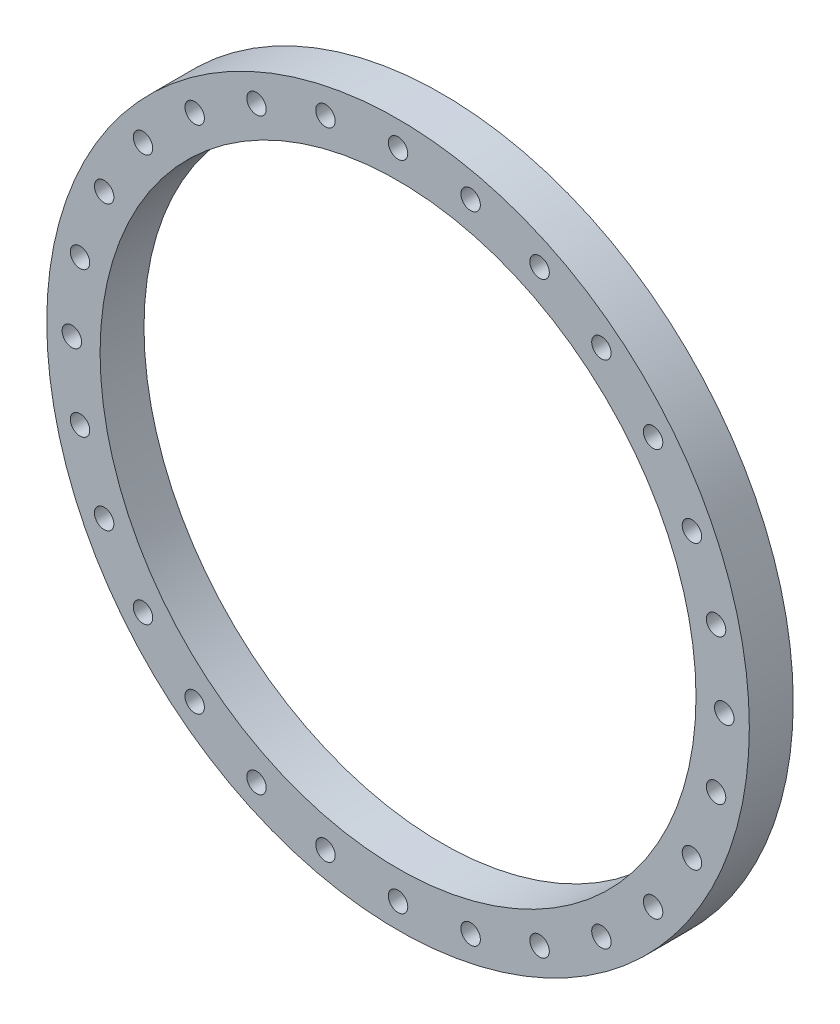
ISO-10303-21;
HEADER;
FILE_DESCRIPTION(('STEP AP214'),'2;1');
FILE_NAME('part.step','',(''),(''),'','','');
FILE_SCHEMA(('AUTOMOTIVE_DESIGN { 1 0 10303 214 1 1 1 1 }'));
ENDSEC;
DATA;
#1=APPLICATION_CONTEXT('core data for automotive mechanical design processes');
#2=APPLICATION_PROTOCOL_DEFINITION('international standard','automotive_design',2000,#1);
#3=PRODUCT_CONTEXT('',#1,'mechanical');
#4=PRODUCT('Part','Part','',(#3));
#5=PRODUCT_RELATED_PRODUCT_CATEGORY('part','',(#4));
#6=PRODUCT_DEFINITION_FORMATION('','',#4);
#7=PRODUCT_DEFINITION_CONTEXT('part definition',#1,'design');
#8=PRODUCT_DEFINITION('design','',#6,#7);
#9=PRODUCT_DEFINITION_SHAPE('','',#8);
#10=(LENGTH_UNIT() NAMED_UNIT(*) SI_UNIT(.MILLI.,.METRE.));
#11=(NAMED_UNIT(*) PLANE_ANGLE_UNIT() SI_UNIT($,.RADIAN.));
#12=(NAMED_UNIT(*) SI_UNIT($,.STERADIAN.) SOLID_ANGLE_UNIT());
#13=UNCERTAINTY_MEASURE_WITH_UNIT(LENGTH_MEASURE(1.E-05),#10,'distance_accuracy_value','');
#14=(GEOMETRIC_REPRESENTATION_CONTEXT(3) GLOBAL_UNCERTAINTY_ASSIGNED_CONTEXT((#13)) GLOBAL_UNIT_ASSIGNED_CONTEXT((#10,
#11,#12)) REPRESENTATION_CONTEXT('',''));
#15=CARTESIAN_POINT('',(0.,0.,0.));
#16=DIRECTION('',(0.,0.,1.));
#17=DIRECTION('',(1.,0.,0.));
#18=AXIS2_PLACEMENT_3D('',#15,#16,#17);
#19=CARTESIAN_POINT('',(0.,0.,7.));
#20=DIRECTION('',(0.,0.,1.));
#21=DIRECTION('',(1.,0.,0.));
#22=AXIS2_PLACEMENT_3D('',#19,#20,#21);
#23=PLANE('',#22);
#24=CARTESIAN_POINT('',(-22.561954434113,46.8503811309258,7.));
#25=DIRECTION('',(0.,0.,1.));
#26=DIRECTION('',(1.,0.,0.));
#27=AXIS2_PLACEMENT_3D('',#24,#25,#26);
#28=CIRCLE('',#27,1.55);
#29=CARTESIAN_POINT('',(-21.011954434113,46.8503811309258,7.));
#30=VERTEX_POINT('',#29);
#31=EDGE_CURVE('E206',#30,#30,#28,.T.);
#32=ORIENTED_EDGE('',*,*,#31,.F.);
#33=EDGE_LOOP('',(#32));
#34=FACE_BOUND('',#33,.T.);
#35=CARTESIAN_POINT('',(-40.6552370883376,32.4214696966541,7.));
#36=DIRECTION('',(0.,0.,1.));
#37=DIRECTION('',(1.,0.,0.));
#38=AXIS2_PLACEMENT_3D('',#35,#36,#37);
#39=CIRCLE('',#38,1.55);
#40=CARTESIAN_POINT('',(-39.1052370883376,32.4214696966541,7.));
#41=VERTEX_POINT('',#40);
#42=EDGE_CURVE('E194',#41,#41,#39,.T.);
#43=ORIENTED_EDGE('',*,*,#42,.F.);
#44=EDGE_LOOP('',(#43));
#45=FACE_BOUND('',#44,.T.);
#46=CARTESIAN_POINT('',(-50.6962514334548,11.5710885657283,7.));
#47=DIRECTION('',(0.,0.,1.));
#48=DIRECTION('',(1.,0.,0.));
#49=AXIS2_PLACEMENT_3D('',#46,#47,#48);
#50=CIRCLE('',#49,1.55);
#51=CARTESIAN_POINT('',(-49.1462514334548,11.5710885657283,7.));
#52=VERTEX_POINT('',#51);
#53=EDGE_CURVE('E182',#52,#52,#50,.T.);
#54=ORIENTED_EDGE('',*,*,#53,.F.);
#55=EDGE_LOOP('',(#54));
#56=FACE_BOUND('',#55,.T.);
#57=CARTESIAN_POINT('',(-50.6962514334548,-11.5710885657284,7.));
#58=DIRECTION('',(0.,0.,1.));
#59=DIRECTION('',(1.,0.,0.));
#60=AXIS2_PLACEMENT_3D('',#57,#58,#59);
#61=CIRCLE('',#60,1.55);
#62=CARTESIAN_POINT('',(-49.1462514334548,-11.5710885657284,7.));
#63=VERTEX_POINT('',#62);
#64=EDGE_CURVE('E170',#63,#63,#61,.T.);
#65=ORIENTED_EDGE('',*,*,#64,.F.);
#66=EDGE_LOOP('',(#65));
#67=FACE_BOUND('',#66,.T.);
#68=CARTESIAN_POINT('',(-40.6552370883375,-32.4214696966541,7.));
#69=DIRECTION('',(0.,0.,1.));
#70=DIRECTION('',(1.,0.,0.));
#71=AXIS2_PLACEMENT_3D('',#68,#69,#70);
#72=CIRCLE('',#71,1.54999999999999);
#73=CARTESIAN_POINT('',(-39.1052370883375,-32.4214696966541,7.));
#74=VERTEX_POINT('',#73);
#75=EDGE_CURVE('E158',#74,#74,#72,.T.);
#76=ORIENTED_EDGE('',*,*,#75,.F.);
#77=EDGE_LOOP('',(#76));
#78=FACE_BOUND('',#77,.T.);
#79=CARTESIAN_POINT('',(-22.561954434113,-46.8503811309258,7.));
#80=DIRECTION('',(0.,0.,1.));
#81=DIRECTION('',(1.,0.,0.));
#82=AXIS2_PLACEMENT_3D('',#79,#80,#81);
#83=CIRCLE('',#82,1.55);
#84=CARTESIAN_POINT('',(-21.011954434113,-46.8503811309258,7.));
#85=VERTEX_POINT('',#84);
#86=EDGE_CURVE('E146',#85,#85,#83,.T.);
#87=ORIENTED_EDGE('',*,*,#86,.F.);
#88=EDGE_LOOP('',(#87));
#89=FACE_BOUND('',#88,.T.);
#90=CARTESIAN_POINT('',(0.,-52.,7.));
#91=DIRECTION('',(0.,0.,1.));
#92=DIRECTION('',(1.,0.,0.));
#93=AXIS2_PLACEMENT_3D('',#90,#91,#92);
#94=CIRCLE('',#93,1.55);
#95=CARTESIAN_POINT('',(1.55000000000001,-52.,7.));
#96=VERTEX_POINT('',#95);
#97=EDGE_CURVE('E134',#96,#96,#94,.T.);
#98=ORIENTED_EDGE('',*,*,#97,.F.);
#99=EDGE_LOOP('',(#98));
#100=FACE_BOUND('',#99,.T.);
#101=CARTESIAN_POINT('',(22.561954434113,-46.8503811309258,7.));
#102=DIRECTION('',(0.,0.,1.));
#103=DIRECTION('',(1.,0.,0.));
#104=AXIS2_PLACEMENT_3D('',#101,#102,#103);
#105=CIRCLE('',#104,1.54999999999999);
#106=CARTESIAN_POINT('',(24.111954434113,-46.8503811309258,7.));
#107=VERTEX_POINT('',#106);
#108=EDGE_CURVE('E122',#107,#107,#105,.T.);
#109=ORIENTED_EDGE('',*,*,#108,.F.);
#110=EDGE_LOOP('',(#109));
#111=FACE_BOUND('',#110,.T.);
#112=CARTESIAN_POINT('',(40.6552370883376,-32.4214696966541,7.));
#113=DIRECTION('',(0.,0.,1.));
#114=DIRECTION('',(1.,0.,0.));
#115=AXIS2_PLACEMENT_3D('',#112,#113,#114);
#116=CIRCLE('',#115,1.55);
#117=CARTESIAN_POINT('',(42.2052370883376,-32.4214696966541,7.));
#118=VERTEX_POINT('',#117);
#119=EDGE_CURVE('E110',#118,#118,#116,.T.);
#120=ORIENTED_EDGE('',*,*,#119,.F.);
#121=EDGE_LOOP('',(#120));
#122=FACE_BOUND('',#121,.T.);
#123=CARTESIAN_POINT('',(50.6962514334548,-11.5710885657283,7.));
#124=DIRECTION('',(0.,0.,1.));
#125=DIRECTION('',(1.,0.,0.));
#126=AXIS2_PLACEMENT_3D('',#123,#124,#125);
#127=CIRCLE('',#126,1.54999999999999);
#128=CARTESIAN_POINT('',(52.2462514334548,-11.5710885657283,7.));
#129=VERTEX_POINT('',#128);
#130=EDGE_CURVE('E98',#129,#129,#127,.T.);
#131=ORIENTED_EDGE('',*,*,#130,.F.);
#132=EDGE_LOOP('',(#131));
#133=FACE_BOUND('',#132,.T.);
#134=CARTESIAN_POINT('',(50.6962514334548,11.5710885657283,7.));
#135=DIRECTION('',(0.,0.,1.));
#136=DIRECTION('',(1.,0.,0.));
#137=AXIS2_PLACEMENT_3D('',#134,#135,#136);
#138=CIRCLE('',#137,1.55);
#139=CARTESIAN_POINT('',(52.2462514334548,11.5710885657283,7.));
#140=VERTEX_POINT('',#139);
#141=EDGE_CURVE('E86',#140,#140,#138,.T.);
#142=ORIENTED_EDGE('',*,*,#141,.F.);
#143=EDGE_LOOP('',(#142));
#144=FACE_BOUND('',#143,.T.);
#145=CARTESIAN_POINT('',(40.6552370883376,32.4214696966541,7.));
#146=DIRECTION('',(0.,0.,1.));
#147=DIRECTION('',(1.,0.,0.));
#148=AXIS2_PLACEMENT_3D('',#145,#146,#147);
#149=CIRCLE('',#148,1.54999999999999);
#150=CARTESIAN_POINT('',(42.2052370883375,32.4214696966541,7.));
#151=VERTEX_POINT('',#150);
#152=EDGE_CURVE('E74',#151,#151,#149,.T.);
#153=ORIENTED_EDGE('',*,*,#152,.F.);
#154=EDGE_LOOP('',(#153));
#155=FACE_BOUND('',#154,.T.);
#156=CARTESIAN_POINT('',(22.561954434113,46.8503811309258,7.));
#157=DIRECTION('',(0.,0.,1.));
#158=DIRECTION('',(1.,0.,0.));
#159=AXIS2_PLACEMENT_3D('',#156,#157,#158);
#160=CIRCLE('',#159,1.55);
#161=CARTESIAN_POINT('',(24.111954434113,46.8503811309258,7.));
#162=VERTEX_POINT('',#161);
#163=EDGE_CURVE('E62',#162,#162,#160,.T.);
#164=ORIENTED_EDGE('',*,*,#163,.F.);
#165=EDGE_LOOP('',(#164));
#166=FACE_BOUND('',#165,.T.);
#167=CARTESIAN_POINT('',(0.,52.,7.));
#168=DIRECTION('',(0.,0.,1.));
#169=DIRECTION('',(1.,0.,0.));
#170=AXIS2_PLACEMENT_3D('',#167,#168,#169);
#171=CIRCLE('',#170,1.55);
#172=CARTESIAN_POINT('',(1.55,52.,7.));
#173=VERTEX_POINT('',#172);
#174=EDGE_CURVE('E50',#173,#173,#171,.T.);
#175=ORIENTED_EDGE('',*,*,#174,.F.);
#176=EDGE_LOOP('',(#175));
#177=FACE_BOUND('',#176,.T.);
#178=CARTESIAN_POINT('',(0.,0.,7.));
#179=DIRECTION('',(0.,0.,1.));
#180=DIRECTION('',(1.,0.,0.));
#181=AXIS2_PLACEMENT_3D('',#178,#179,#180);
#182=CIRCLE('',#181,56.);
#183=CARTESIAN_POINT('',(56.,0.,7.));
#184=VERTEX_POINT('',#183);
#185=EDGE_CURVE('E10',#184,#184,#182,.T.);
#186=ORIENTED_EDGE('',*,*,#185,.T.);
#187=EDGE_LOOP('',(#186));
#188=FACE_BOUND('',#187,.T.);
#189=CARTESIAN_POINT('',(0.,0.,7.));
#190=DIRECTION('',(0.,0.,1.));
#191=DIRECTION('',(1.,0.,0.));
#192=AXIS2_PLACEMENT_3D('',#189,#190,#191);
#193=CIRCLE('',#192,47.5);
#194=CARTESIAN_POINT('',(47.5,0.,7.));
#195=VERTEX_POINT('',#194);
#196=EDGE_CURVE('E45',#195,#195,#193,.T.);
#197=ORIENTED_EDGE('',*,*,#196,.F.);
#198=EDGE_LOOP('',(#197));
#199=FACE_BOUND('',#198,.T.);
#200=CARTESIAN_POINT('',(11.5710885657283,50.6962514334548,7.));
#201=DIRECTION('',(0.,0.,1.));
#202=DIRECTION('',(1.,0.,0.));
#203=AXIS2_PLACEMENT_3D('',#200,#201,#202);
#204=CIRCLE('',#203,1.55);
#205=CARTESIAN_POINT('',(13.1210885657283,50.6962514334548,7.));
#206=VERTEX_POINT('',#205);
#207=EDGE_CURVE('E56',#206,#206,#204,.T.);
#208=ORIENTED_EDGE('',*,*,#207,.F.);
#209=EDGE_LOOP('',(#208));
#210=FACE_BOUND('',#209,.T.);
#211=CARTESIAN_POINT('',(32.4214696966541,40.6552370883376,7.));
#212=DIRECTION('',(0.,0.,1.));
#213=DIRECTION('',(1.,0.,0.));
#214=AXIS2_PLACEMENT_3D('',#211,#212,#213);
#215=CIRCLE('',#214,1.54999999999999);
#216=CARTESIAN_POINT('',(33.9714696966541,40.6552370883376,7.));
#217=VERTEX_POINT('',#216);
#218=EDGE_CURVE('E68',#217,#217,#215,.T.);
#219=ORIENTED_EDGE('',*,*,#218,.F.);
#220=EDGE_LOOP('',(#219));
#221=FACE_BOUND('',#220,.T.);
#222=CARTESIAN_POINT('',(46.8503811309258,22.561954434113,7.));
#223=DIRECTION('',(0.,0.,1.));
#224=DIRECTION('',(1.,0.,0.));
#225=AXIS2_PLACEMENT_3D('',#222,#223,#224);
#226=CIRCLE('',#225,1.55);
#227=CARTESIAN_POINT('',(48.4003811309258,22.561954434113,7.));
#228=VERTEX_POINT('',#227);
#229=EDGE_CURVE('E80',#228,#228,#226,.T.);
#230=ORIENTED_EDGE('',*,*,#229,.F.);
#231=EDGE_LOOP('',(#230));
#232=FACE_BOUND('',#231,.T.);
#233=CARTESIAN_POINT('',(52.,0.,7.));
#234=DIRECTION('',(0.,0.,1.));
#235=DIRECTION('',(1.,0.,0.));
#236=AXIS2_PLACEMENT_3D('',#233,#234,#235);
#237=CIRCLE('',#236,1.54999999999999);
#238=CARTESIAN_POINT('',(53.55,0.,7.));
#239=VERTEX_POINT('',#238);
#240=EDGE_CURVE('E92',#239,#239,#237,.T.);
#241=ORIENTED_EDGE('',*,*,#240,.F.);
#242=EDGE_LOOP('',(#241));
#243=FACE_BOUND('',#242,.T.);
#244=CARTESIAN_POINT('',(46.8503811309258,-22.561954434113,7.));
#245=DIRECTION('',(0.,0.,1.));
#246=DIRECTION('',(1.,0.,0.));
#247=AXIS2_PLACEMENT_3D('',#244,#245,#246);
#248=CIRCLE('',#247,1.54999999999999);
#249=CARTESIAN_POINT('',(48.4003811309258,-22.561954434113,7.));
#250=VERTEX_POINT('',#249);
#251=EDGE_CURVE('E104',#250,#250,#248,.T.);
#252=ORIENTED_EDGE('',*,*,#251,.F.);
#253=EDGE_LOOP('',(#252));
#254=FACE_BOUND('',#253,.T.);
#255=CARTESIAN_POINT('',(32.4214696966541,-40.6552370883375,7.));
#256=DIRECTION('',(0.,0.,1.));
#257=DIRECTION('',(1.,0.,0.));
#258=AXIS2_PLACEMENT_3D('',#255,#256,#257);
#259=CIRCLE('',#258,1.54999999999999);
#260=CARTESIAN_POINT('',(33.9714696966541,-40.6552370883375,7.));
#261=VERTEX_POINT('',#260);
#262=EDGE_CURVE('E116',#261,#261,#259,.T.);
#263=ORIENTED_EDGE('',*,*,#262,.F.);
#264=EDGE_LOOP('',(#263));
#265=FACE_BOUND('',#264,.T.);
#266=CARTESIAN_POINT('',(11.5710885657284,-50.6962514334548,7.));
#267=DIRECTION('',(0.,0.,1.));
#268=DIRECTION('',(1.,0.,0.));
#269=AXIS2_PLACEMENT_3D('',#266,#267,#268);
#270=CIRCLE('',#269,1.55);
#271=CARTESIAN_POINT('',(13.1210885657284,-50.6962514334548,7.));
#272=VERTEX_POINT('',#271);
#273=EDGE_CURVE('E128',#272,#272,#270,.T.);
#274=ORIENTED_EDGE('',*,*,#273,.F.);
#275=EDGE_LOOP('',(#274));
#276=FACE_BOUND('',#275,.T.);
#277=CARTESIAN_POINT('',(-11.5710885657283,-50.6962514334548,7.));
#278=DIRECTION('',(0.,0.,1.));
#279=DIRECTION('',(1.,0.,0.));
#280=AXIS2_PLACEMENT_3D('',#277,#278,#279);
#281=CIRCLE('',#280,1.55);
#282=CARTESIAN_POINT('',(-10.0210885657283,-50.6962514334548,7.));
#283=VERTEX_POINT('',#282);
#284=EDGE_CURVE('E140',#283,#283,#281,.T.);
#285=ORIENTED_EDGE('',*,*,#284,.F.);
#286=EDGE_LOOP('',(#285));
#287=FACE_BOUND('',#286,.T.);
#288=CARTESIAN_POINT('',(-32.4214696966541,-40.6552370883376,7.));
#289=DIRECTION('',(0.,0.,1.));
#290=DIRECTION('',(1.,0.,0.));
#291=AXIS2_PLACEMENT_3D('',#288,#289,#290);
#292=CIRCLE('',#291,1.55);
#293=CARTESIAN_POINT('',(-30.8714696966541,-40.6552370883376,7.));
#294=VERTEX_POINT('',#293);
#295=EDGE_CURVE('E152',#294,#294,#292,.T.);
#296=ORIENTED_EDGE('',*,*,#295,.F.);
#297=EDGE_LOOP('',(#296));
#298=FACE_BOUND('',#297,.T.);
#299=CARTESIAN_POINT('',(-46.8503811309258,-22.561954434113,7.));
#300=DIRECTION('',(0.,0.,1.));
#301=DIRECTION('',(1.,0.,0.));
#302=AXIS2_PLACEMENT_3D('',#299,#300,#301);
#303=CIRCLE('',#302,1.55);
#304=CARTESIAN_POINT('',(-45.3003811309258,-22.561954434113,7.));
#305=VERTEX_POINT('',#304);
#306=EDGE_CURVE('E164',#305,#305,#303,.T.);
#307=ORIENTED_EDGE('',*,*,#306,.F.);
#308=EDGE_LOOP('',(#307));
#309=FACE_BOUND('',#308,.T.);
#310=CARTESIAN_POINT('',(-52.,0.,7.));
#311=DIRECTION('',(0.,0.,1.));
#312=DIRECTION('',(1.,0.,0.));
#313=AXIS2_PLACEMENT_3D('',#310,#311,#312);
#314=CIRCLE('',#313,1.55);
#315=CARTESIAN_POINT('',(-50.45,0.,7.));
#316=VERTEX_POINT('',#315);
#317=EDGE_CURVE('E176',#316,#316,#314,.T.);
#318=ORIENTED_EDGE('',*,*,#317,.F.);
#319=EDGE_LOOP('',(#318));
#320=FACE_BOUND('',#319,.T.);
#321=CARTESIAN_POINT('',(-46.8503811309258,22.561954434113,7.));
#322=DIRECTION('',(0.,0.,1.));
#323=DIRECTION('',(1.,0.,0.));
#324=AXIS2_PLACEMENT_3D('',#321,#322,#323);
#325=CIRCLE('',#324,1.55);
#326=CARTESIAN_POINT('',(-45.3003811309258,22.561954434113,7.));
#327=VERTEX_POINT('',#326);
#328=EDGE_CURVE('E188',#327,#327,#325,.T.);
#329=ORIENTED_EDGE('',*,*,#328,.F.);
#330=EDGE_LOOP('',(#329));
#331=FACE_BOUND('',#330,.T.);
#332=CARTESIAN_POINT('',(-32.4214696966541,40.6552370883375,7.));
#333=DIRECTION('',(0.,0.,1.));
#334=DIRECTION('',(1.,0.,0.));
#335=AXIS2_PLACEMENT_3D('',#332,#333,#334);
#336=CIRCLE('',#335,1.55);
#337=CARTESIAN_POINT('',(-30.8714696966541,40.6552370883375,7.));
#338=VERTEX_POINT('',#337);
#339=EDGE_CURVE('E200',#338,#338,#336,.T.);
#340=ORIENTED_EDGE('',*,*,#339,.F.);
#341=EDGE_LOOP('',(#340));
#342=FACE_BOUND('',#341,.T.);
#343=CARTESIAN_POINT('',(-11.5710885657284,50.6962514334548,7.));
#344=DIRECTION('',(0.,0.,1.));
#345=DIRECTION('',(1.,0.,0.));
#346=AXIS2_PLACEMENT_3D('',#343,#344,#345);
#347=CIRCLE('',#346,1.55);
#348=CARTESIAN_POINT('',(-10.0210885657284,50.6962514334548,7.));
#349=VERTEX_POINT('',#348);
#350=EDGE_CURVE('E212',#349,#349,#347,.T.);
#351=ORIENTED_EDGE('',*,*,#350,.F.);
#352=EDGE_LOOP('',(#351));
#353=FACE_BOUND('',#352,.T.);
#354=ADVANCED_FACE('F34',(#34,#45,#56,#67,#78,#89,#100,#111,#122,#133,#144,#155,#166,#177,#188,
#199,#210,#221,#232,#243,#254,#265,#276,#287,#298,#309,#320,#331,#342,#353),#23,.T.);
#355=CARTESIAN_POINT('',(0.,0.,0.));
#356=DIRECTION('',(0.,0.,1.));
#357=DIRECTION('',(1.,0.,0.));
#358=AXIS2_PLACEMENT_3D('',#355,#356,#357);
#359=PLANE('',#358);
#360=CARTESIAN_POINT('',(0.,0.,0.));
#361=DIRECTION('',(0.,0.,1.));
#362=DIRECTION('',(1.,0.,0.));
#363=AXIS2_PLACEMENT_3D('',#360,#361,#362);
#364=CIRCLE('',#363,56.);
#365=CARTESIAN_POINT('',(56.,0.,0.));
#366=VERTEX_POINT('',#365);
#367=EDGE_CURVE('E38',#366,#366,#364,.T.);
#368=ORIENTED_EDGE('',*,*,#367,.F.);
#369=EDGE_LOOP('',(#368));
#370=FACE_BOUND('',#369,.T.);
#371=CARTESIAN_POINT('',(0.,0.,0.));
#372=DIRECTION('',(0.,0.,1.));
#373=DIRECTION('',(1.,0.,0.));
#374=AXIS2_PLACEMENT_3D('',#371,#372,#373);
#375=CIRCLE('',#374,47.5);
#376=CARTESIAN_POINT('',(47.5,0.,0.));
#377=VERTEX_POINT('',#376);
#378=EDGE_CURVE('E47',#377,#377,#375,.T.);
#379=ORIENTED_EDGE('',*,*,#378,.T.);
#380=EDGE_LOOP('',(#379));
#381=FACE_BOUND('',#380,.T.);
#382=CARTESIAN_POINT('',(0.,52.,0.));
#383=DIRECTION('',(0.,0.,1.));
#384=DIRECTION('',(1.,0.,0.));
#385=AXIS2_PLACEMENT_3D('',#382,#383,#384);
#386=CIRCLE('',#385,1.55);
#387=CARTESIAN_POINT('',(1.55,52.,0.));
#388=VERTEX_POINT('',#387);
#389=EDGE_CURVE('E53',#388,#388,#386,.T.);
#390=ORIENTED_EDGE('',*,*,#389,.T.);
#391=EDGE_LOOP('',(#390));
#392=FACE_BOUND('',#391,.T.);
#393=CARTESIAN_POINT('',(11.5710885657283,50.6962514334548,0.));
#394=DIRECTION('',(0.,0.,1.));
#395=DIRECTION('',(1.,0.,0.));
#396=AXIS2_PLACEMENT_3D('',#393,#394,#395);
#397=CIRCLE('',#396,1.55);
#398=CARTESIAN_POINT('',(13.1210885657283,50.6962514334548,0.));
#399=VERTEX_POINT('',#398);
#400=EDGE_CURVE('E59',#399,#399,#397,.T.);
#401=ORIENTED_EDGE('',*,*,#400,.T.);
#402=EDGE_LOOP('',(#401));
#403=FACE_BOUND('',#402,.T.);
#404=CARTESIAN_POINT('',(22.561954434113,46.8503811309258,0.));
#405=DIRECTION('',(0.,0.,1.));
#406=DIRECTION('',(1.,0.,0.));
#407=AXIS2_PLACEMENT_3D('',#404,#405,#406);
#408=CIRCLE('',#407,1.55);
#409=CARTESIAN_POINT('',(24.111954434113,46.8503811309258,0.));
#410=VERTEX_POINT('',#409);
#411=EDGE_CURVE('E65',#410,#410,#408,.T.);
#412=ORIENTED_EDGE('',*,*,#411,.T.);
#413=EDGE_LOOP('',(#412));
#414=FACE_BOUND('',#413,.T.);
#415=CARTESIAN_POINT('',(32.4214696966541,40.6552370883376,0.));
#416=DIRECTION('',(0.,0.,1.));
#417=DIRECTION('',(1.,0.,0.));
#418=AXIS2_PLACEMENT_3D('',#415,#416,#417);
#419=CIRCLE('',#418,1.54999999999999);
#420=CARTESIAN_POINT('',(33.9714696966541,40.6552370883376,0.));
#421=VERTEX_POINT('',#420);
#422=EDGE_CURVE('E71',#421,#421,#419,.T.);
#423=ORIENTED_EDGE('',*,*,#422,.T.);
#424=EDGE_LOOP('',(#423));
#425=FACE_BOUND('',#424,.T.);
#426=CARTESIAN_POINT('',(40.6552370883376,32.4214696966541,0.));
#427=DIRECTION('',(0.,0.,1.));
#428=DIRECTION('',(1.,0.,0.));
#429=AXIS2_PLACEMENT_3D('',#426,#427,#428);
#430=CIRCLE('',#429,1.54999999999999);
#431=CARTESIAN_POINT('',(42.2052370883375,32.4214696966541,0.));
#432=VERTEX_POINT('',#431);
#433=EDGE_CURVE('E77',#432,#432,#430,.T.);
#434=ORIENTED_EDGE('',*,*,#433,.T.);
#435=EDGE_LOOP('',(#434));
#436=FACE_BOUND('',#435,.T.);
#437=CARTESIAN_POINT('',(46.8503811309258,22.561954434113,0.));
#438=DIRECTION('',(0.,0.,1.));
#439=DIRECTION('',(1.,0.,0.));
#440=AXIS2_PLACEMENT_3D('',#437,#438,#439);
#441=CIRCLE('',#440,1.55);
#442=CARTESIAN_POINT('',(48.4003811309258,22.561954434113,0.));
#443=VERTEX_POINT('',#442);
#444=EDGE_CURVE('E83',#443,#443,#441,.T.);
#445=ORIENTED_EDGE('',*,*,#444,.T.);
#446=EDGE_LOOP('',(#445));
#447=FACE_BOUND('',#446,.T.);
#448=CARTESIAN_POINT('',(50.6962514334548,11.5710885657283,0.));
#449=DIRECTION('',(0.,0.,1.));
#450=DIRECTION('',(1.,0.,0.));
#451=AXIS2_PLACEMENT_3D('',#448,#449,#450);
#452=CIRCLE('',#451,1.55);
#453=CARTESIAN_POINT('',(52.2462514334548,11.5710885657283,0.));
#454=VERTEX_POINT('',#453);
#455=EDGE_CURVE('E89',#454,#454,#452,.T.);
#456=ORIENTED_EDGE('',*,*,#455,.T.);
#457=EDGE_LOOP('',(#456));
#458=FACE_BOUND('',#457,.T.);
#459=CARTESIAN_POINT('',(52.,0.,0.));
#460=DIRECTION('',(0.,0.,1.));
#461=DIRECTION('',(1.,0.,0.));
#462=AXIS2_PLACEMENT_3D('',#459,#460,#461);
#463=CIRCLE('',#462,1.54999999999999);
#464=CARTESIAN_POINT('',(53.55,0.,0.));
#465=VERTEX_POINT('',#464);
#466=EDGE_CURVE('E95',#465,#465,#463,.T.);
#467=ORIENTED_EDGE('',*,*,#466,.T.);
#468=EDGE_LOOP('',(#467));
#469=FACE_BOUND('',#468,.T.);
#470=CARTESIAN_POINT('',(50.6962514334548,-11.5710885657283,0.));
#471=DIRECTION('',(0.,0.,1.));
#472=DIRECTION('',(1.,0.,0.));
#473=AXIS2_PLACEMENT_3D('',#470,#471,#472);
#474=CIRCLE('',#473,1.54999999999999);
#475=CARTESIAN_POINT('',(52.2462514334548,-11.5710885657283,0.));
#476=VERTEX_POINT('',#475);
#477=EDGE_CURVE('E101',#476,#476,#474,.T.);
#478=ORIENTED_EDGE('',*,*,#477,.T.);
#479=EDGE_LOOP('',(#478));
#480=FACE_BOUND('',#479,.T.);
#481=CARTESIAN_POINT('',(46.8503811309258,-22.561954434113,0.));
#482=DIRECTION('',(0.,0.,1.));
#483=DIRECTION('',(1.,0.,0.));
#484=AXIS2_PLACEMENT_3D('',#481,#482,#483);
#485=CIRCLE('',#484,1.54999999999999);
#486=CARTESIAN_POINT('',(48.4003811309258,-22.561954434113,0.));
#487=VERTEX_POINT('',#486);
#488=EDGE_CURVE('E107',#487,#487,#485,.T.);
#489=ORIENTED_EDGE('',*,*,#488,.T.);
#490=EDGE_LOOP('',(#489));
#491=FACE_BOUND('',#490,.T.);
#492=CARTESIAN_POINT('',(40.6552370883376,-32.4214696966541,0.));
#493=DIRECTION('',(0.,0.,1.));
#494=DIRECTION('',(1.,0.,0.));
#495=AXIS2_PLACEMENT_3D('',#492,#493,#494);
#496=CIRCLE('',#495,1.55);
#497=CARTESIAN_POINT('',(42.2052370883376,-32.4214696966541,0.));
#498=VERTEX_POINT('',#497);
#499=EDGE_CURVE('E113',#498,#498,#496,.T.);
#500=ORIENTED_EDGE('',*,*,#499,.T.);
#501=EDGE_LOOP('',(#500));
#502=FACE_BOUND('',#501,.T.);
#503=CARTESIAN_POINT('',(32.4214696966541,-40.6552370883375,0.));
#504=DIRECTION('',(0.,0.,1.));
#505=DIRECTION('',(1.,0.,0.));
#506=AXIS2_PLACEMENT_3D('',#503,#504,#505);
#507=CIRCLE('',#506,1.54999999999999);
#508=CARTESIAN_POINT('',(33.9714696966541,-40.6552370883375,0.));
#509=VERTEX_POINT('',#508);
#510=EDGE_CURVE('E119',#509,#509,#507,.T.);
#511=ORIENTED_EDGE('',*,*,#510,.T.);
#512=EDGE_LOOP('',(#511));
#513=FACE_BOUND('',#512,.T.);
#514=CARTESIAN_POINT('',(22.561954434113,-46.8503811309258,0.));
#515=DIRECTION('',(0.,0.,1.));
#516=DIRECTION('',(1.,0.,0.));
#517=AXIS2_PLACEMENT_3D('',#514,#515,#516);
#518=CIRCLE('',#517,1.54999999999999);
#519=CARTESIAN_POINT('',(24.111954434113,-46.8503811309258,0.));
#520=VERTEX_POINT('',#519);
#521=EDGE_CURVE('E125',#520,#520,#518,.T.);
#522=ORIENTED_EDGE('',*,*,#521,.T.);
#523=EDGE_LOOP('',(#522));
#524=FACE_BOUND('',#523,.T.);
#525=CARTESIAN_POINT('',(11.5710885657284,-50.6962514334548,0.));
#526=DIRECTION('',(0.,0.,1.));
#527=DIRECTION('',(1.,0.,0.));
#528=AXIS2_PLACEMENT_3D('',#525,#526,#527);
#529=CIRCLE('',#528,1.55);
#530=CARTESIAN_POINT('',(13.1210885657284,-50.6962514334548,0.));
#531=VERTEX_POINT('',#530);
#532=EDGE_CURVE('E131',#531,#531,#529,.T.);
#533=ORIENTED_EDGE('',*,*,#532,.T.);
#534=EDGE_LOOP('',(#533));
#535=FACE_BOUND('',#534,.T.);
#536=CARTESIAN_POINT('',(0.,-52.,0.));
#537=DIRECTION('',(0.,0.,1.));
#538=DIRECTION('',(1.,0.,0.));
#539=AXIS2_PLACEMENT_3D('',#536,#537,#538);
#540=CIRCLE('',#539,1.55);
#541=CARTESIAN_POINT('',(1.55000000000001,-52.,0.));
#542=VERTEX_POINT('',#541);
#543=EDGE_CURVE('E137',#542,#542,#540,.T.);
#544=ORIENTED_EDGE('',*,*,#543,.T.);
#545=EDGE_LOOP('',(#544));
#546=FACE_BOUND('',#545,.T.);
#547=CARTESIAN_POINT('',(-11.5710885657283,-50.6962514334548,0.));
#548=DIRECTION('',(0.,0.,1.));
#549=DIRECTION('',(1.,0.,0.));
#550=AXIS2_PLACEMENT_3D('',#547,#548,#549);
#551=CIRCLE('',#550,1.55);
#552=CARTESIAN_POINT('',(-10.0210885657283,-50.6962514334548,0.));
#553=VERTEX_POINT('',#552);
#554=EDGE_CURVE('E143',#553,#553,#551,.T.);
#555=ORIENTED_EDGE('',*,*,#554,.T.);
#556=EDGE_LOOP('',(#555));
#557=FACE_BOUND('',#556,.T.);
#558=CARTESIAN_POINT('',(-22.561954434113,-46.8503811309258,0.));
#559=DIRECTION('',(0.,0.,1.));
#560=DIRECTION('',(1.,0.,0.));
#561=AXIS2_PLACEMENT_3D('',#558,#559,#560);
#562=CIRCLE('',#561,1.55);
#563=CARTESIAN_POINT('',(-21.011954434113,-46.8503811309258,0.));
#564=VERTEX_POINT('',#563);
#565=EDGE_CURVE('E149',#564,#564,#562,.T.);
#566=ORIENTED_EDGE('',*,*,#565,.T.);
#567=EDGE_LOOP('',(#566));
#568=FACE_BOUND('',#567,.T.);
#569=CARTESIAN_POINT('',(-32.4214696966541,-40.6552370883376,0.));
#570=DIRECTION('',(0.,0.,1.));
#571=DIRECTION('',(1.,0.,0.));
#572=AXIS2_PLACEMENT_3D('',#569,#570,#571);
#573=CIRCLE('',#572,1.55);
#574=CARTESIAN_POINT('',(-30.8714696966541,-40.6552370883376,0.));
#575=VERTEX_POINT('',#574);
#576=EDGE_CURVE('E155',#575,#575,#573,.T.);
#577=ORIENTED_EDGE('',*,*,#576,.T.);
#578=EDGE_LOOP('',(#577));
#579=FACE_BOUND('',#578,.T.);
#580=CARTESIAN_POINT('',(-40.6552370883375,-32.4214696966541,0.));
#581=DIRECTION('',(0.,0.,1.));
#582=DIRECTION('',(1.,0.,0.));
#583=AXIS2_PLACEMENT_3D('',#580,#581,#582);
#584=CIRCLE('',#583,1.54999999999999);
#585=CARTESIAN_POINT('',(-39.1052370883375,-32.4214696966541,0.));
#586=VERTEX_POINT('',#585);
#587=EDGE_CURVE('E161',#586,#586,#584,.T.);
#588=ORIENTED_EDGE('',*,*,#587,.T.);
#589=EDGE_LOOP('',(#588));
#590=FACE_BOUND('',#589,.T.);
#591=CARTESIAN_POINT('',(-46.8503811309258,-22.561954434113,0.));
#592=DIRECTION('',(0.,0.,1.));
#593=DIRECTION('',(1.,0.,0.));
#594=AXIS2_PLACEMENT_3D('',#591,#592,#593);
#595=CIRCLE('',#594,1.55);
#596=CARTESIAN_POINT('',(-45.3003811309258,-22.561954434113,0.));
#597=VERTEX_POINT('',#596);
#598=EDGE_CURVE('E167',#597,#597,#595,.T.);
#599=ORIENTED_EDGE('',*,*,#598,.T.);
#600=EDGE_LOOP('',(#599));
#601=FACE_BOUND('',#600,.T.);
#602=CARTESIAN_POINT('',(-50.6962514334548,-11.5710885657284,0.));
#603=DIRECTION('',(0.,0.,1.));
#604=DIRECTION('',(1.,0.,0.));
#605=AXIS2_PLACEMENT_3D('',#602,#603,#604);
#606=CIRCLE('',#605,1.55);
#607=CARTESIAN_POINT('',(-49.1462514334548,-11.5710885657284,0.));
#608=VERTEX_POINT('',#607);
#609=EDGE_CURVE('E173',#608,#608,#606,.T.);
#610=ORIENTED_EDGE('',*,*,#609,.T.);
#611=EDGE_LOOP('',(#610));
#612=FACE_BOUND('',#611,.T.);
#613=CARTESIAN_POINT('',(-52.,0.,0.));
#614=DIRECTION('',(0.,0.,1.));
#615=DIRECTION('',(1.,0.,0.));
#616=AXIS2_PLACEMENT_3D('',#613,#614,#615);
#617=CIRCLE('',#616,1.55);
#618=CARTESIAN_POINT('',(-50.45,0.,0.));
#619=VERTEX_POINT('',#618);
#620=EDGE_CURVE('E179',#619,#619,#617,.T.);
#621=ORIENTED_EDGE('',*,*,#620,.T.);
#622=EDGE_LOOP('',(#621));
#623=FACE_BOUND('',#622,.T.);
#624=CARTESIAN_POINT('',(-50.6962514334548,11.5710885657283,0.));
#625=DIRECTION('',(0.,0.,1.));
#626=DIRECTION('',(1.,0.,0.));
#627=AXIS2_PLACEMENT_3D('',#624,#625,#626);
#628=CIRCLE('',#627,1.55);
#629=CARTESIAN_POINT('',(-49.1462514334548,11.5710885657283,0.));
#630=VERTEX_POINT('',#629);
#631=EDGE_CURVE('E185',#630,#630,#628,.T.);
#632=ORIENTED_EDGE('',*,*,#631,.T.);
#633=EDGE_LOOP('',(#632));
#634=FACE_BOUND('',#633,.T.);
#635=CARTESIAN_POINT('',(-46.8503811309258,22.561954434113,0.));
#636=DIRECTION('',(0.,0.,1.));
#637=DIRECTION('',(1.,0.,0.));
#638=AXIS2_PLACEMENT_3D('',#635,#636,#637);
#639=CIRCLE('',#638,1.55);
#640=CARTESIAN_POINT('',(-45.3003811309258,22.561954434113,0.));
#641=VERTEX_POINT('',#640);
#642=EDGE_CURVE('E191',#641,#641,#639,.T.);
#643=ORIENTED_EDGE('',*,*,#642,.T.);
#644=EDGE_LOOP('',(#643));
#645=FACE_BOUND('',#644,.T.);
#646=CARTESIAN_POINT('',(-40.6552370883376,32.4214696966541,0.));
#647=DIRECTION('',(0.,0.,1.));
#648=DIRECTION('',(1.,0.,0.));
#649=AXIS2_PLACEMENT_3D('',#646,#647,#648);
#650=CIRCLE('',#649,1.55);
#651=CARTESIAN_POINT('',(-39.1052370883376,32.4214696966541,0.));
#652=VERTEX_POINT('',#651);
#653=EDGE_CURVE('E197',#652,#652,#650,.T.);
#654=ORIENTED_EDGE('',*,*,#653,.T.);
#655=EDGE_LOOP('',(#654));
#656=FACE_BOUND('',#655,.T.);
#657=CARTESIAN_POINT('',(-32.4214696966541,40.6552370883375,0.));
#658=DIRECTION('',(0.,0.,1.));
#659=DIRECTION('',(1.,0.,0.));
#660=AXIS2_PLACEMENT_3D('',#657,#658,#659);
#661=CIRCLE('',#660,1.55);
#662=CARTESIAN_POINT('',(-30.8714696966541,40.6552370883375,0.));
#663=VERTEX_POINT('',#662);
#664=EDGE_CURVE('E203',#663,#663,#661,.T.);
#665=ORIENTED_EDGE('',*,*,#664,.T.);
#666=EDGE_LOOP('',(#665));
#667=FACE_BOUND('',#666,.T.);
#668=CARTESIAN_POINT('',(-22.561954434113,46.8503811309258,0.));
#669=DIRECTION('',(0.,0.,1.));
#670=DIRECTION('',(1.,0.,0.));
#671=AXIS2_PLACEMENT_3D('',#668,#669,#670);
#672=CIRCLE('',#671,1.55);
#673=CARTESIAN_POINT('',(-21.011954434113,46.8503811309258,0.));
#674=VERTEX_POINT('',#673);
#675=EDGE_CURVE('E209',#674,#674,#672,.T.);
#676=ORIENTED_EDGE('',*,*,#675,.T.);
#677=EDGE_LOOP('',(#676));
#678=FACE_BOUND('',#677,.T.);
#679=CARTESIAN_POINT('',(-11.5710885657284,50.6962514334548,0.));
#680=DIRECTION('',(0.,0.,1.));
#681=DIRECTION('',(1.,0.,0.));
#682=AXIS2_PLACEMENT_3D('',#679,#680,#681);
#683=CIRCLE('',#682,1.55);
#684=CARTESIAN_POINT('',(-10.0210885657284,50.6962514334548,0.));
#685=VERTEX_POINT('',#684);
#686=EDGE_CURVE('E215',#685,#685,#683,.T.);
#687=ORIENTED_EDGE('',*,*,#686,.T.);
#688=EDGE_LOOP('',(#687));
#689=FACE_BOUND('',#688,.T.);
#690=ADVANCED_FACE('F225',(#370,#381,#392,#403,#414,#425,#436,#447,#458,#469,#480,#491,#502,
#513,#524,#535,#546,#557,#568,#579,#590,#601,#612,#623,#634,#645,#656,#667,#678,#689),#359,.F.);
#691=CARTESIAN_POINT('',(0.,0.,7.));
#692=DIRECTION('',(0.,0.,-1.));
#693=DIRECTION('',(-1.,0.,0.));
#694=AXIS2_PLACEMENT_3D('',#691,#692,#693);
#695=CYLINDRICAL_SURFACE('',#694,56.);
#696=ORIENTED_EDGE('',*,*,#185,.F.);
#697=EDGE_LOOP('',(#696));
#698=FACE_BOUND('',#697,.T.);
#699=ORIENTED_EDGE('',*,*,#367,.T.);
#700=EDGE_LOOP('',(#699));
#701=FACE_BOUND('',#700,.T.);
#702=ADVANCED_FACE('F36',(#698,#701),#695,.T.);
#703=CARTESIAN_POINT('',(0.,0.,7.));
#704=DIRECTION('',(0.,0.,-1.));
#705=DIRECTION('',(-1.,0.,0.));
#706=AXIS2_PLACEMENT_3D('',#703,#704,#705);
#707=CYLINDRICAL_SURFACE('',#706,47.5);
#708=ORIENTED_EDGE('',*,*,#196,.T.);
#709=EDGE_LOOP('',(#708));
#710=FACE_BOUND('',#709,.T.);
#711=ORIENTED_EDGE('',*,*,#378,.F.);
#712=EDGE_LOOP('',(#711));
#713=FACE_BOUND('',#712,.T.);
#714=ADVANCED_FACE('F235',(#710,#713),#707,.F.);
#715=CARTESIAN_POINT('',(0.,52.,7.));
#716=DIRECTION('',(0.,0.,-1.));
#717=DIRECTION('',(-1.,0.,0.));
#718=AXIS2_PLACEMENT_3D('',#715,#716,#717);
#719=CYLINDRICAL_SURFACE('',#718,1.55);
#720=ORIENTED_EDGE('',*,*,#174,.T.);
#721=EDGE_LOOP('',(#720));
#722=FACE_BOUND('',#721,.T.);
#723=ORIENTED_EDGE('',*,*,#389,.F.);
#724=EDGE_LOOP('',(#723));
#725=FACE_BOUND('',#724,.T.);
#726=ADVANCED_FACE('F238',(#722,#725),#719,.F.);
#727=CARTESIAN_POINT('',(11.5710885657283,50.6962514334548,7.));
#728=DIRECTION('',(0.,0.,-1.));
#729=DIRECTION('',(-1.,0.,0.));
#730=AXIS2_PLACEMENT_3D('',#727,#728,#729);
#731=CYLINDRICAL_SURFACE('',#730,1.55);
#732=ORIENTED_EDGE('',*,*,#207,.T.);
#733=EDGE_LOOP('',(#732));
#734=FACE_BOUND('',#733,.T.);
#735=ORIENTED_EDGE('',*,*,#400,.F.);
#736=EDGE_LOOP('',(#735));
#737=FACE_BOUND('',#736,.T.);
#738=ADVANCED_FACE('F242',(#734,#737),#731,.F.);
#739=CARTESIAN_POINT('',(22.561954434113,46.8503811309258,7.));
#740=DIRECTION('',(0.,0.,-1.));
#741=DIRECTION('',(-1.,0.,0.));
#742=AXIS2_PLACEMENT_3D('',#739,#740,#741);
#743=CYLINDRICAL_SURFACE('',#742,1.55);
#744=ORIENTED_EDGE('',*,*,#163,.T.);
#745=EDGE_LOOP('',(#744));
#746=FACE_BOUND('',#745,.T.);
#747=ORIENTED_EDGE('',*,*,#411,.F.);
#748=EDGE_LOOP('',(#747));
#749=FACE_BOUND('',#748,.T.);
#750=ADVANCED_FACE('F246',(#746,#749),#743,.F.);
#751=CARTESIAN_POINT('',(32.4214696966541,40.6552370883376,7.));
#752=DIRECTION('',(0.,0.,-1.));
#753=DIRECTION('',(-1.,0.,0.));
#754=AXIS2_PLACEMENT_3D('',#751,#752,#753);
#755=CYLINDRICAL_SURFACE('',#754,1.54999999999999);
#756=ORIENTED_EDGE('',*,*,#218,.T.);
#757=EDGE_LOOP('',(#756));
#758=FACE_BOUND('',#757,.T.);
#759=ORIENTED_EDGE('',*,*,#422,.F.);
#760=EDGE_LOOP('',(#759));
#761=FACE_BOUND('',#760,.T.);
#762=ADVANCED_FACE('F250',(#758,#761),#755,.F.);
#763=CARTESIAN_POINT('',(40.6552370883376,32.4214696966541,7.));
#764=DIRECTION('',(0.,0.,-1.));
#765=DIRECTION('',(-1.,0.,0.));
#766=AXIS2_PLACEMENT_3D('',#763,#764,#765);
#767=CYLINDRICAL_SURFACE('',#766,1.54999999999999);
#768=ORIENTED_EDGE('',*,*,#152,.T.);
#769=EDGE_LOOP('',(#768));
#770=FACE_BOUND('',#769,.T.);
#771=ORIENTED_EDGE('',*,*,#433,.F.);
#772=EDGE_LOOP('',(#771));
#773=FACE_BOUND('',#772,.T.);
#774=ADVANCED_FACE('F254',(#770,#773),#767,.F.);
#775=CARTESIAN_POINT('',(46.8503811309258,22.561954434113,7.));
#776=DIRECTION('',(0.,0.,-1.));
#777=DIRECTION('',(-1.,0.,0.));
#778=AXIS2_PLACEMENT_3D('',#775,#776,#777);
#779=CYLINDRICAL_SURFACE('',#778,1.55);
#780=ORIENTED_EDGE('',*,*,#229,.T.);
#781=EDGE_LOOP('',(#780));
#782=FACE_BOUND('',#781,.T.);
#783=ORIENTED_EDGE('',*,*,#444,.F.);
#784=EDGE_LOOP('',(#783));
#785=FACE_BOUND('',#784,.T.);
#786=ADVANCED_FACE('F258',(#782,#785),#779,.F.);
#787=CARTESIAN_POINT('',(50.6962514334548,11.5710885657283,7.));
#788=DIRECTION('',(0.,0.,-1.));
#789=DIRECTION('',(-1.,0.,0.));
#790=AXIS2_PLACEMENT_3D('',#787,#788,#789);
#791=CYLINDRICAL_SURFACE('',#790,1.55);
#792=ORIENTED_EDGE('',*,*,#141,.T.);
#793=EDGE_LOOP('',(#792));
#794=FACE_BOUND('',#793,.T.);
#795=ORIENTED_EDGE('',*,*,#455,.F.);
#796=EDGE_LOOP('',(#795));
#797=FACE_BOUND('',#796,.T.);
#798=ADVANCED_FACE('F262',(#794,#797),#791,.F.);
#799=CARTESIAN_POINT('',(52.,0.,7.));
#800=DIRECTION('',(0.,0.,-1.));
#801=DIRECTION('',(-1.,0.,0.));
#802=AXIS2_PLACEMENT_3D('',#799,#800,#801);
#803=CYLINDRICAL_SURFACE('',#802,1.54999999999999);
#804=ORIENTED_EDGE('',*,*,#240,.T.);
#805=EDGE_LOOP('',(#804));
#806=FACE_BOUND('',#805,.T.);
#807=ORIENTED_EDGE('',*,*,#466,.F.);
#808=EDGE_LOOP('',(#807));
#809=FACE_BOUND('',#808,.T.);
#810=ADVANCED_FACE('F266',(#806,#809),#803,.F.);
#811=CARTESIAN_POINT('',(50.6962514334548,-11.5710885657283,7.));
#812=DIRECTION('',(0.,0.,-1.));
#813=DIRECTION('',(-1.,0.,0.));
#814=AXIS2_PLACEMENT_3D('',#811,#812,#813);
#815=CYLINDRICAL_SURFACE('',#814,1.54999999999999);
#816=ORIENTED_EDGE('',*,*,#130,.T.);
#817=EDGE_LOOP('',(#816));
#818=FACE_BOUND('',#817,.T.);
#819=ORIENTED_EDGE('',*,*,#477,.F.);
#820=EDGE_LOOP('',(#819));
#821=FACE_BOUND('',#820,.T.);
#822=ADVANCED_FACE('F270',(#818,#821),#815,.F.);
#823=CARTESIAN_POINT('',(46.8503811309258,-22.561954434113,7.));
#824=DIRECTION('',(0.,0.,-1.));
#825=DIRECTION('',(-1.,0.,0.));
#826=AXIS2_PLACEMENT_3D('',#823,#824,#825);
#827=CYLINDRICAL_SURFACE('',#826,1.54999999999999);
#828=ORIENTED_EDGE('',*,*,#251,.T.);
#829=EDGE_LOOP('',(#828));
#830=FACE_BOUND('',#829,.T.);
#831=ORIENTED_EDGE('',*,*,#488,.F.);
#832=EDGE_LOOP('',(#831));
#833=FACE_BOUND('',#832,.T.);
#834=ADVANCED_FACE('F274',(#830,#833),#827,.F.);
#835=CARTESIAN_POINT('',(40.6552370883376,-32.4214696966541,7.));
#836=DIRECTION('',(0.,0.,-1.));
#837=DIRECTION('',(-1.,0.,0.));
#838=AXIS2_PLACEMENT_3D('',#835,#836,#837);
#839=CYLINDRICAL_SURFACE('',#838,1.55);
#840=ORIENTED_EDGE('',*,*,#119,.T.);
#841=EDGE_LOOP('',(#840));
#842=FACE_BOUND('',#841,.T.);
#843=ORIENTED_EDGE('',*,*,#499,.F.);
#844=EDGE_LOOP('',(#843));
#845=FACE_BOUND('',#844,.T.);
#846=ADVANCED_FACE('F278',(#842,#845),#839,.F.);
#847=CARTESIAN_POINT('',(32.4214696966541,-40.6552370883375,7.));
#848=DIRECTION('',(0.,0.,-1.));
#849=DIRECTION('',(-1.,0.,0.));
#850=AXIS2_PLACEMENT_3D('',#847,#848,#849);
#851=CYLINDRICAL_SURFACE('',#850,1.54999999999999);
#852=ORIENTED_EDGE('',*,*,#262,.T.);
#853=EDGE_LOOP('',(#852));
#854=FACE_BOUND('',#853,.T.);
#855=ORIENTED_EDGE('',*,*,#510,.F.);
#856=EDGE_LOOP('',(#855));
#857=FACE_BOUND('',#856,.T.);
#858=ADVANCED_FACE('F282',(#854,#857),#851,.F.);
#859=CARTESIAN_POINT('',(22.561954434113,-46.8503811309258,7.));
#860=DIRECTION('',(0.,0.,-1.));
#861=DIRECTION('',(-1.,0.,0.));
#862=AXIS2_PLACEMENT_3D('',#859,#860,#861);
#863=CYLINDRICAL_SURFACE('',#862,1.54999999999999);
#864=ORIENTED_EDGE('',*,*,#108,.T.);
#865=EDGE_LOOP('',(#864));
#866=FACE_BOUND('',#865,.T.);
#867=ORIENTED_EDGE('',*,*,#521,.F.);
#868=EDGE_LOOP('',(#867));
#869=FACE_BOUND('',#868,.T.);
#870=ADVANCED_FACE('F286',(#866,#869),#863,.F.);
#871=CARTESIAN_POINT('',(11.5710885657284,-50.6962514334548,7.));
#872=DIRECTION('',(0.,0.,-1.));
#873=DIRECTION('',(-1.,0.,0.));
#874=AXIS2_PLACEMENT_3D('',#871,#872,#873);
#875=CYLINDRICAL_SURFACE('',#874,1.55);
#876=ORIENTED_EDGE('',*,*,#273,.T.);
#877=EDGE_LOOP('',(#876));
#878=FACE_BOUND('',#877,.T.);
#879=ORIENTED_EDGE('',*,*,#532,.F.);
#880=EDGE_LOOP('',(#879));
#881=FACE_BOUND('',#880,.T.);
#882=ADVANCED_FACE('F290',(#878,#881),#875,.F.);
#883=CARTESIAN_POINT('',(0.,-52.,7.));
#884=DIRECTION('',(0.,0.,-1.));
#885=DIRECTION('',(-1.,0.,0.));
#886=AXIS2_PLACEMENT_3D('',#883,#884,#885);
#887=CYLINDRICAL_SURFACE('',#886,1.55);
#888=ORIENTED_EDGE('',*,*,#97,.T.);
#889=EDGE_LOOP('',(#888));
#890=FACE_BOUND('',#889,.T.);
#891=ORIENTED_EDGE('',*,*,#543,.F.);
#892=EDGE_LOOP('',(#891));
#893=FACE_BOUND('',#892,.T.);
#894=ADVANCED_FACE('F294',(#890,#893),#887,.F.);
#895=CARTESIAN_POINT('',(-11.5710885657283,-50.6962514334548,7.));
#896=DIRECTION('',(0.,0.,-1.));
#897=DIRECTION('',(-1.,0.,0.));
#898=AXIS2_PLACEMENT_3D('',#895,#896,#897);
#899=CYLINDRICAL_SURFACE('',#898,1.55);
#900=ORIENTED_EDGE('',*,*,#284,.T.);
#901=EDGE_LOOP('',(#900));
#902=FACE_BOUND('',#901,.T.);
#903=ORIENTED_EDGE('',*,*,#554,.F.);
#904=EDGE_LOOP('',(#903));
#905=FACE_BOUND('',#904,.T.);
#906=ADVANCED_FACE('F298',(#902,#905),#899,.F.);
#907=CARTESIAN_POINT('',(-22.561954434113,-46.8503811309258,7.));
#908=DIRECTION('',(0.,0.,-1.));
#909=DIRECTION('',(-1.,0.,0.));
#910=AXIS2_PLACEMENT_3D('',#907,#908,#909);
#911=CYLINDRICAL_SURFACE('',#910,1.55);
#912=ORIENTED_EDGE('',*,*,#86,.T.);
#913=EDGE_LOOP('',(#912));
#914=FACE_BOUND('',#913,.T.);
#915=ORIENTED_EDGE('',*,*,#565,.F.);
#916=EDGE_LOOP('',(#915));
#917=FACE_BOUND('',#916,.T.);
#918=ADVANCED_FACE('F302',(#914,#917),#911,.F.);
#919=CARTESIAN_POINT('',(-32.4214696966541,-40.6552370883376,7.));
#920=DIRECTION('',(0.,0.,-1.));
#921=DIRECTION('',(-1.,0.,0.));
#922=AXIS2_PLACEMENT_3D('',#919,#920,#921);
#923=CYLINDRICAL_SURFACE('',#922,1.55);
#924=ORIENTED_EDGE('',*,*,#295,.T.);
#925=EDGE_LOOP('',(#924));
#926=FACE_BOUND('',#925,.T.);
#927=ORIENTED_EDGE('',*,*,#576,.F.);
#928=EDGE_LOOP('',(#927));
#929=FACE_BOUND('',#928,.T.);
#930=ADVANCED_FACE('F306',(#926,#929),#923,.F.);
#931=CARTESIAN_POINT('',(-40.6552370883375,-32.4214696966541,7.));
#932=DIRECTION('',(0.,0.,-1.));
#933=DIRECTION('',(-1.,0.,0.));
#934=AXIS2_PLACEMENT_3D('',#931,#932,#933);
#935=CYLINDRICAL_SURFACE('',#934,1.54999999999999);
#936=ORIENTED_EDGE('',*,*,#75,.T.);
#937=EDGE_LOOP('',(#936));
#938=FACE_BOUND('',#937,.T.);
#939=ORIENTED_EDGE('',*,*,#587,.F.);
#940=EDGE_LOOP('',(#939));
#941=FACE_BOUND('',#940,.T.);
#942=ADVANCED_FACE('F310',(#938,#941),#935,.F.);
#943=CARTESIAN_POINT('',(-46.8503811309258,-22.561954434113,7.));
#944=DIRECTION('',(0.,0.,-1.));
#945=DIRECTION('',(-1.,0.,0.));
#946=AXIS2_PLACEMENT_3D('',#943,#944,#945);
#947=CYLINDRICAL_SURFACE('',#946,1.55);
#948=ORIENTED_EDGE('',*,*,#306,.T.);
#949=EDGE_LOOP('',(#948));
#950=FACE_BOUND('',#949,.T.);
#951=ORIENTED_EDGE('',*,*,#598,.F.);
#952=EDGE_LOOP('',(#951));
#953=FACE_BOUND('',#952,.T.);
#954=ADVANCED_FACE('F314',(#950,#953),#947,.F.);
#955=CARTESIAN_POINT('',(-50.6962514334548,-11.5710885657284,7.));
#956=DIRECTION('',(0.,0.,-1.));
#957=DIRECTION('',(-1.,0.,0.));
#958=AXIS2_PLACEMENT_3D('',#955,#956,#957);
#959=CYLINDRICAL_SURFACE('',#958,1.55);
#960=ORIENTED_EDGE('',*,*,#64,.T.);
#961=EDGE_LOOP('',(#960));
#962=FACE_BOUND('',#961,.T.);
#963=ORIENTED_EDGE('',*,*,#609,.F.);
#964=EDGE_LOOP('',(#963));
#965=FACE_BOUND('',#964,.T.);
#966=ADVANCED_FACE('F318',(#962,#965),#959,.F.);
#967=CARTESIAN_POINT('',(-52.,0.,7.));
#968=DIRECTION('',(0.,0.,-1.));
#969=DIRECTION('',(-1.,0.,0.));
#970=AXIS2_PLACEMENT_3D('',#967,#968,#969);
#971=CYLINDRICAL_SURFACE('',#970,1.55);
#972=ORIENTED_EDGE('',*,*,#317,.T.);
#973=EDGE_LOOP('',(#972));
#974=FACE_BOUND('',#973,.T.);
#975=ORIENTED_EDGE('',*,*,#620,.F.);
#976=EDGE_LOOP('',(#975));
#977=FACE_BOUND('',#976,.T.);
#978=ADVANCED_FACE('F322',(#974,#977),#971,.F.);
#979=CARTESIAN_POINT('',(-50.6962514334548,11.5710885657283,7.));
#980=DIRECTION('',(0.,0.,-1.));
#981=DIRECTION('',(-1.,0.,0.));
#982=AXIS2_PLACEMENT_3D('',#979,#980,#981);
#983=CYLINDRICAL_SURFACE('',#982,1.55);
#984=ORIENTED_EDGE('',*,*,#53,.T.);
#985=EDGE_LOOP('',(#984));
#986=FACE_BOUND('',#985,.T.);
#987=ORIENTED_EDGE('',*,*,#631,.F.);
#988=EDGE_LOOP('',(#987));
#989=FACE_BOUND('',#988,.T.);
#990=ADVANCED_FACE('F326',(#986,#989),#983,.F.);
#991=CARTESIAN_POINT('',(-46.8503811309258,22.561954434113,7.));
#992=DIRECTION('',(0.,0.,-1.));
#993=DIRECTION('',(-1.,0.,0.));
#994=AXIS2_PLACEMENT_3D('',#991,#992,#993);
#995=CYLINDRICAL_SURFACE('',#994,1.55);
#996=ORIENTED_EDGE('',*,*,#328,.T.);
#997=EDGE_LOOP('',(#996));
#998=FACE_BOUND('',#997,.T.);
#999=ORIENTED_EDGE('',*,*,#642,.F.);
#1000=EDGE_LOOP('',(#999));
#1001=FACE_BOUND('',#1000,.T.);
#1002=ADVANCED_FACE('F330',(#998,#1001),#995,.F.);
#1003=CARTESIAN_POINT('',(-40.6552370883376,32.4214696966541,7.));
#1004=DIRECTION('',(0.,0.,-1.));
#1005=DIRECTION('',(-1.,0.,0.));
#1006=AXIS2_PLACEMENT_3D('',#1003,#1004,#1005);
#1007=CYLINDRICAL_SURFACE('',#1006,1.55);
#1008=ORIENTED_EDGE('',*,*,#42,.T.);
#1009=EDGE_LOOP('',(#1008));
#1010=FACE_BOUND('',#1009,.T.);
#1011=ORIENTED_EDGE('',*,*,#653,.F.);
#1012=EDGE_LOOP('',(#1011));
#1013=FACE_BOUND('',#1012,.T.);
#1014=ADVANCED_FACE('F334',(#1010,#1013),#1007,.F.);
#1015=CARTESIAN_POINT('',(-32.4214696966541,40.6552370883375,7.));
#1016=DIRECTION('',(0.,0.,-1.));
#1017=DIRECTION('',(-1.,0.,0.));
#1018=AXIS2_PLACEMENT_3D('',#1015,#1016,#1017);
#1019=CYLINDRICAL_SURFACE('',#1018,1.55);
#1020=ORIENTED_EDGE('',*,*,#339,.T.);
#1021=EDGE_LOOP('',(#1020));
#1022=FACE_BOUND('',#1021,.T.);
#1023=ORIENTED_EDGE('',*,*,#664,.F.);
#1024=EDGE_LOOP('',(#1023));
#1025=FACE_BOUND('',#1024,.T.);
#1026=ADVANCED_FACE('F338',(#1022,#1025),#1019,.F.);
#1027=CARTESIAN_POINT('',(-22.561954434113,46.8503811309258,7.));
#1028=DIRECTION('',(0.,0.,-1.));
#1029=DIRECTION('',(-1.,0.,0.));
#1030=AXIS2_PLACEMENT_3D('',#1027,#1028,#1029);
#1031=CYLINDRICAL_SURFACE('',#1030,1.55);
#1032=ORIENTED_EDGE('',*,*,#31,.T.);
#1033=EDGE_LOOP('',(#1032));
#1034=FACE_BOUND('',#1033,.T.);
#1035=ORIENTED_EDGE('',*,*,#675,.F.);
#1036=EDGE_LOOP('',(#1035));
#1037=FACE_BOUND('',#1036,.T.);
#1038=ADVANCED_FACE('F342',(#1034,#1037),#1031,.F.);
#1039=CARTESIAN_POINT('',(-11.5710885657284,50.6962514334548,7.));
#1040=DIRECTION('',(0.,0.,-1.));
#1041=DIRECTION('',(-1.,0.,0.));
#1042=AXIS2_PLACEMENT_3D('',#1039,#1040,#1041);
#1043=CYLINDRICAL_SURFACE('',#1042,1.55);
#1044=ORIENTED_EDGE('',*,*,#350,.T.);
#1045=EDGE_LOOP('',(#1044));
#1046=FACE_BOUND('',#1045,.T.);
#1047=ORIENTED_EDGE('',*,*,#686,.F.);
#1048=EDGE_LOOP('',(#1047));
#1049=FACE_BOUND('',#1048,.T.);
#1050=ADVANCED_FACE('F221',(#1046,#1049),#1043,.F.);
#1051=CLOSED_SHELL('',(#354,#690,#702,#714,#726,#738,#750,#762,#774,#786,#798,#810,#822,#834,
#846,#858,#870,#882,#894,#906,#918,#930,#942,#954,#966,#978,#990,#1002,#1014,#1026,#1038,#1050));
#1052=MANIFOLD_SOLID_BREP('B2',#1051);
#1053=ADVANCED_BREP_SHAPE_REPRESENTATION('',(#18,#1052),#14);
#1054=SHAPE_DEFINITION_REPRESENTATION(#9,#1053);
ENDSEC;
END-ISO-10303-21;
